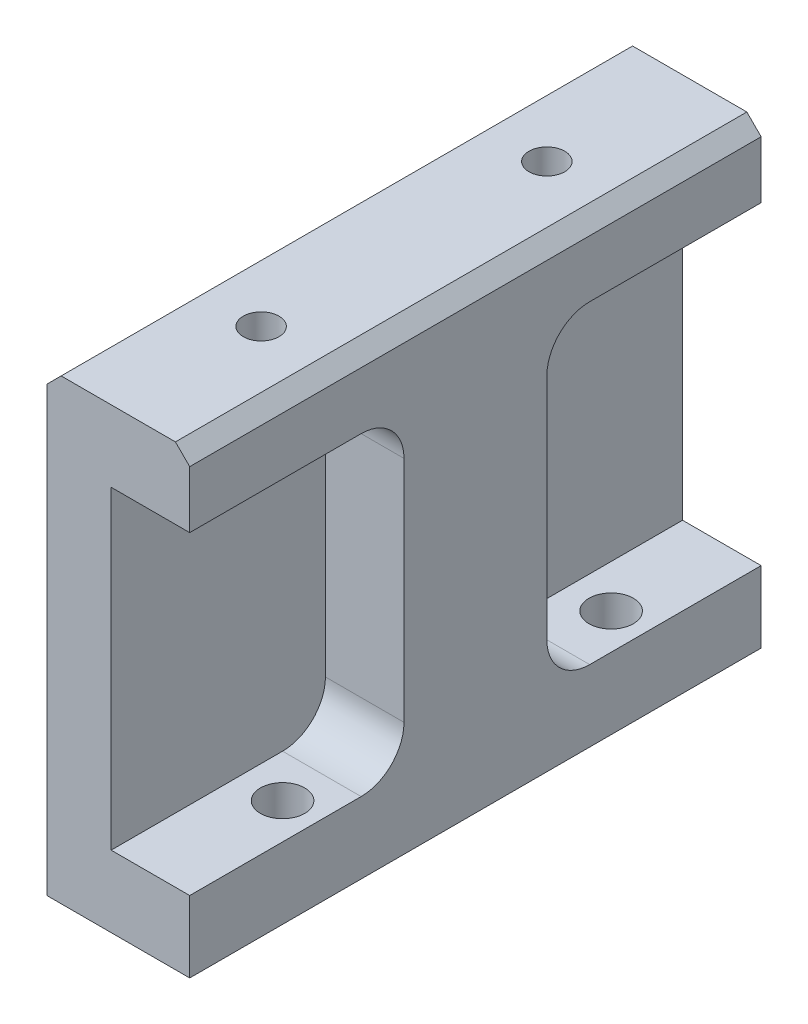
ISO-10303-21;
HEADER;
FILE_DESCRIPTION(('STEP AP214'),'2;1');
FILE_NAME('part.step','',(''),(''),'','','');
FILE_SCHEMA(('AUTOMOTIVE_DESIGN { 1 0 10303 214 1 1 1 1 }'));
ENDSEC;
DATA;
#1=APPLICATION_CONTEXT('core data for automotive mechanical design processes');
#2=APPLICATION_PROTOCOL_DEFINITION('international standard','automotive_design',2000,#1);
#3=PRODUCT_CONTEXT('',#1,'mechanical');
#4=PRODUCT('Part','Part','',(#3));
#5=PRODUCT_RELATED_PRODUCT_CATEGORY('part','',(#4));
#6=PRODUCT_DEFINITION_FORMATION('','',#4);
#7=PRODUCT_DEFINITION_CONTEXT('part definition',#1,'design');
#8=PRODUCT_DEFINITION('design','',#6,#7);
#9=PRODUCT_DEFINITION_SHAPE('','',#8);
#10=(LENGTH_UNIT() NAMED_UNIT(*) SI_UNIT(.MILLI.,.METRE.));
#11=(NAMED_UNIT(*) PLANE_ANGLE_UNIT() SI_UNIT($,.RADIAN.));
#12=(NAMED_UNIT(*) SI_UNIT($,.STERADIAN.) SOLID_ANGLE_UNIT());
#13=UNCERTAINTY_MEASURE_WITH_UNIT(LENGTH_MEASURE(1.E-05),#10,'distance_accuracy_value','');
#14=(GEOMETRIC_REPRESENTATION_CONTEXT(3) GLOBAL_UNCERTAINTY_ASSIGNED_CONTEXT((#13)) GLOBAL_UNIT_ASSIGNED_CONTEXT((#10,
#11,#12)) REPRESENTATION_CONTEXT('',''));
#15=CARTESIAN_POINT('',(0.,0.,0.));
#16=DIRECTION('',(0.,0.,1.));
#17=DIRECTION('',(1.,0.,0.));
#18=AXIS2_PLACEMENT_3D('',#15,#16,#17);
#19=CARTESIAN_POINT('',(4.5,24.,28.));
#20=DIRECTION('',(1.,0.,0.));
#21=DIRECTION('',(0.,1.,0.));
#22=AXIS2_PLACEMENT_3D('',#19,#20,#21);
#23=CYLINDRICAL_SURFACE('',#22,3.);
#24=CARTESIAN_POINT('',(10.,24.,28.));
#25=DIRECTION('',(-1.,0.,0.));
#26=DIRECTION('',(0.,1.,0.));
#27=AXIS2_PLACEMENT_3D('',#24,#25,#26);
#28=CIRCLE('',#27,3.);
#29=CARTESIAN_POINT('',(10.,27.,28.));
#30=VERTEX_POINT('',#29);
#31=CARTESIAN_POINT('',(10.,24.,25.));
#32=VERTEX_POINT('',#31);
#33=EDGE_CURVE('E318',#30,#32,#28,.T.);
#34=ORIENTED_EDGE('',*,*,#33,.F.);
#35=DIRECTION('',(1.,0.,0.));
#36=VECTOR('',#35,1.);
#37=CARTESIAN_POINT('',(10.,27.,28.));
#38=LINE('',#37,#36);
#39=CARTESIAN_POINT('',(4.50000000000006,27.,28.));
#40=VERTEX_POINT('',#39);
#41=EDGE_CURVE('E332',#40,#30,#38,.T.);
#42=ORIENTED_EDGE('',*,*,#41,.F.);
#43=CARTESIAN_POINT('',(4.5,24.,28.));
#44=DIRECTION('',(1.,0.,0.));
#45=DIRECTION('',(0.,1.,0.));
#46=AXIS2_PLACEMENT_3D('',#43,#44,#45);
#47=CIRCLE('',#46,3.);
#48=CARTESIAN_POINT('',(4.5,24.,25.));
#49=VERTEX_POINT('',#48);
#50=EDGE_CURVE('E301',#49,#40,#47,.T.);
#51=ORIENTED_EDGE('',*,*,#50,.F.);
#52=DIRECTION('',(-1.,0.,0.));
#53=VECTOR('',#52,1.);
#54=CARTESIAN_POINT('',(4.5,24.,25.));
#55=LINE('',#54,#53);
#56=EDGE_CURVE('E125',#32,#49,#55,.T.);
#57=ORIENTED_EDGE('',*,*,#56,.F.);
#58=EDGE_LOOP('',(#34,#42,#51,#57));
#59=FACE_BOUND('',#58,.T.);
#60=ADVANCED_FACE('F16',(#59),#23,.F.);
#61=CARTESIAN_POINT('',(4.5,8.,28.));
#62=DIRECTION('',(1.,0.,0.));
#63=DIRECTION('',(0.,1.,0.));
#64=AXIS2_PLACEMENT_3D('',#61,#62,#63);
#65=CYLINDRICAL_SURFACE('',#64,3.);
#66=CARTESIAN_POINT('',(10.,8.,28.));
#67=DIRECTION('',(-1.,0.,0.));
#68=DIRECTION('',(0.,1.,0.));
#69=AXIS2_PLACEMENT_3D('',#66,#67,#68);
#70=CIRCLE('',#69,3.);
#71=CARTESIAN_POINT('',(10.,8.,25.));
#72=VERTEX_POINT('',#71);
#73=CARTESIAN_POINT('',(10.,5.,28.));
#74=VERTEX_POINT('',#73);
#75=EDGE_CURVE('E275',#72,#74,#70,.T.);
#76=ORIENTED_EDGE('',*,*,#75,.F.);
#77=DIRECTION('',(1.,0.,0.));
#78=VECTOR('',#77,1.);
#79=CARTESIAN_POINT('',(10.,8.,25.));
#80=LINE('',#79,#78);
#81=CARTESIAN_POINT('',(4.5,8.,25.));
#82=VERTEX_POINT('',#81);
#83=EDGE_CURVE('E109',#82,#72,#80,.T.);
#84=ORIENTED_EDGE('',*,*,#83,.F.);
#85=CARTESIAN_POINT('',(4.5,8.,28.));
#86=DIRECTION('',(1.,0.,0.));
#87=DIRECTION('',(0.,1.,0.));
#88=AXIS2_PLACEMENT_3D('',#85,#86,#87);
#89=CIRCLE('',#88,3.);
#90=CARTESIAN_POINT('',(4.5,5.,28.));
#91=VERTEX_POINT('',#90);
#92=EDGE_CURVE('E326',#91,#82,#89,.T.);
#93=ORIENTED_EDGE('',*,*,#92,.F.);
#94=DIRECTION('',(-1.,0.,0.));
#95=VECTOR('',#94,1.);
#96=CARTESIAN_POINT('',(4.5,5.,28.));
#97=LINE('',#96,#95);
#98=EDGE_CURVE('E335',#74,#91,#97,.T.);
#99=ORIENTED_EDGE('',*,*,#98,.F.);
#100=EDGE_LOOP('',(#76,#84,#93,#99));
#101=FACE_BOUND('',#100,.T.);
#102=ADVANCED_FACE('F491',(#101),#65,.F.);
#103=CARTESIAN_POINT('',(4.5,8.,12.));
#104=DIRECTION('',(1.,0.,0.));
#105=DIRECTION('',(0.,1.,0.));
#106=AXIS2_PLACEMENT_3D('',#103,#104,#105);
#107=CYLINDRICAL_SURFACE('',#106,3.);
#108=CARTESIAN_POINT('',(10.,8.,12.));
#109=DIRECTION('',(-1.,0.,0.));
#110=DIRECTION('',(0.,1.,0.));
#111=AXIS2_PLACEMENT_3D('',#108,#109,#110);
#112=CIRCLE('',#111,3.);
#113=CARTESIAN_POINT('',(10.,5.,12.));
#114=VERTEX_POINT('',#113);
#115=CARTESIAN_POINT('',(10.,8.,15.));
#116=VERTEX_POINT('',#115);
#117=EDGE_CURVE('E247',#114,#116,#112,.T.);
#118=ORIENTED_EDGE('',*,*,#117,.F.);
#119=DIRECTION('',(1.,0.,0.));
#120=VECTOR('',#119,1.);
#121=CARTESIAN_POINT('',(10.,5.,12.));
#122=LINE('',#121,#120);
#123=CARTESIAN_POINT('',(4.5,5.,12.));
#124=VERTEX_POINT('',#123);
#125=EDGE_CURVE('E41',#124,#114,#122,.T.);
#126=ORIENTED_EDGE('',*,*,#125,.F.);
#127=CARTESIAN_POINT('',(4.5,8.,12.));
#128=DIRECTION('',(1.,0.,0.));
#129=DIRECTION('',(0.,1.,0.));
#130=AXIS2_PLACEMENT_3D('',#127,#128,#129);
#131=CIRCLE('',#130,3.);
#132=CARTESIAN_POINT('',(4.5,8.,15.));
#133=VERTEX_POINT('',#132);
#134=EDGE_CURVE('E287',#133,#124,#131,.T.);
#135=ORIENTED_EDGE('',*,*,#134,.F.);
#136=DIRECTION('',(-1.,0.,0.));
#137=VECTOR('',#136,1.);
#138=CARTESIAN_POINT('',(4.5,8.,15.));
#139=LINE('',#138,#137);
#140=EDGE_CURVE('E11',#116,#133,#139,.T.);
#141=ORIENTED_EDGE('',*,*,#140,.F.);
#142=EDGE_LOOP('',(#118,#126,#135,#141));
#143=FACE_BOUND('',#142,.T.);
#144=ADVANCED_FACE('F487',(#143),#107,.F.);
#145=CARTESIAN_POINT('',(4.5,24.,12.));
#146=DIRECTION('',(1.,0.,0.));
#147=DIRECTION('',(0.,1.,0.));
#148=AXIS2_PLACEMENT_3D('',#145,#146,#147);
#149=CYLINDRICAL_SURFACE('',#148,3.);
#150=CARTESIAN_POINT('',(10.,24.,12.));
#151=DIRECTION('',(-1.,0.,0.));
#152=DIRECTION('',(0.,1.,0.));
#153=AXIS2_PLACEMENT_3D('',#150,#151,#152);
#154=CIRCLE('',#153,3.);
#155=CARTESIAN_POINT('',(10.,24.,15.));
#156=VERTEX_POINT('',#155);
#157=CARTESIAN_POINT('',(10.,27.,12.));
#158=VERTEX_POINT('',#157);
#159=EDGE_CURVE('E281',#156,#158,#154,.T.);
#160=ORIENTED_EDGE('',*,*,#159,.F.);
#161=DIRECTION('',(1.,0.,0.));
#162=VECTOR('',#161,1.);
#163=CARTESIAN_POINT('',(10.,24.,15.));
#164=LINE('',#163,#162);
#165=CARTESIAN_POINT('',(4.5,24.,15.));
#166=VERTEX_POINT('',#165);
#167=EDGE_CURVE('E27',#166,#156,#164,.T.);
#168=ORIENTED_EDGE('',*,*,#167,.F.);
#169=CARTESIAN_POINT('',(4.5,24.,12.));
#170=DIRECTION('',(1.,0.,0.));
#171=DIRECTION('',(0.,1.,0.));
#172=AXIS2_PLACEMENT_3D('',#169,#170,#171);
#173=CIRCLE('',#172,3.);
#174=CARTESIAN_POINT('',(4.50000000000006,27.,12.));
#175=VERTEX_POINT('',#174);
#176=EDGE_CURVE('E376',#175,#166,#173,.T.);
#177=ORIENTED_EDGE('',*,*,#176,.F.);
#178=DIRECTION('',(-1.,0.,0.));
#179=VECTOR('',#178,1.);
#180=CARTESIAN_POINT('',(4.50000000000006,27.,12.));
#181=LINE('',#180,#179);
#182=EDGE_CURVE('E358',#158,#175,#181,.T.);
#183=ORIENTED_EDGE('',*,*,#182,.F.);
#184=EDGE_LOOP('',(#160,#168,#177,#183));
#185=FACE_BOUND('',#184,.T.);
#186=ADVANCED_FACE('F483',(#185),#149,.F.);
#187=CARTESIAN_POINT('',(4.50000000000006,27.,15.));
#188=DIRECTION('',(0.,0.,1.));
#189=DIRECTION('',(0.,-1.,0.));
#190=AXIS2_PLACEMENT_3D('',#187,#188,#189);
#191=PLANE('',#190);
#192=DIRECTION('',(0.,1.,0.));
#193=VECTOR('',#192,1.);
#194=CARTESIAN_POINT('',(4.50000000000006,27.,15.));
#195=LINE('',#194,#193);
#196=EDGE_CURVE('E292',#133,#166,#195,.T.);
#197=ORIENTED_EDGE('',*,*,#196,.T.);
#198=ORIENTED_EDGE('',*,*,#167,.T.);
#199=DIRECTION('',(0.,-1.,0.));
#200=VECTOR('',#199,1.);
#201=CARTESIAN_POINT('',(10.,27.,15.));
#202=LINE('',#201,#200);
#203=EDGE_CURVE('E366',#156,#116,#202,.T.);
#204=ORIENTED_EDGE('',*,*,#203,.T.);
#205=ORIENTED_EDGE('',*,*,#140,.T.);
#206=EDGE_LOOP('',(#197,#198,#204,#205));
#207=FACE_BOUND('',#206,.T.);
#208=ADVANCED_FACE('F486',(#207),#191,.F.);
#209=CARTESIAN_POINT('',(4.5,5.,15.));
#210=DIRECTION('',(0.,-1.,0.));
#211=DIRECTION('',(-1.,0.,0.));
#212=AXIS2_PLACEMENT_3D('',#209,#210,#211);
#213=PLANE('',#212);
#214=CARTESIAN_POINT('',(7.5,5.,8.));
#215=DIRECTION('',(0.,1.,0.));
#216=DIRECTION('',(1.,0.,0.));
#217=AXIS2_PLACEMENT_3D('',#214,#215,#216);
#218=CIRCLE('',#217,1.55);
#219=CARTESIAN_POINT('',(9.05,5.,8.));
#220=VERTEX_POINT('',#219);
#221=EDGE_CURVE('E350',#220,#220,#218,.T.);
#222=ORIENTED_EDGE('',*,*,#221,.F.);
#223=EDGE_LOOP('',(#222));
#224=FACE_BOUND('',#223,.T.);
#225=DIRECTION('',(0.,0.,1.));
#226=VECTOR('',#225,1.);
#227=CARTESIAN_POINT('',(4.5,5.,15.));
#228=LINE('',#227,#226);
#229=CARTESIAN_POINT('',(4.5,5.,0.));
#230=VERTEX_POINT('',#229);
#231=EDGE_CURVE('E291',#230,#124,#228,.T.);
#232=ORIENTED_EDGE('',*,*,#231,.T.);
#233=ORIENTED_EDGE('',*,*,#125,.T.);
#234=DIRECTION('',(0.,0.,-1.));
#235=VECTOR('',#234,1.);
#236=CARTESIAN_POINT('',(10.,5.,15.));
#237=LINE('',#236,#235);
#238=CARTESIAN_POINT('',(10.,5.,0.));
#239=VERTEX_POINT('',#238);
#240=EDGE_CURVE('E238',#114,#239,#237,.T.);
#241=ORIENTED_EDGE('',*,*,#240,.T.);
#242=DIRECTION('',(1.,0.,0.));
#243=VECTOR('',#242,1.);
#244=CARTESIAN_POINT('',(4.5,5.,0.));
#245=LINE('',#244,#243);
#246=EDGE_CURVE('E242',#230,#239,#245,.T.);
#247=ORIENTED_EDGE('',*,*,#246,.F.);
#248=EDGE_LOOP('',(#232,#233,#241,#247));
#249=FACE_BOUND('',#248,.T.);
#250=ADVANCED_FACE('F240',(#224,#249),#213,.F.);
#251=CARTESIAN_POINT('',(4.50000000000006,27.,0.));
#252=DIRECTION('',(0.,1.,0.));
#253=DIRECTION('',(1.,0.,0.));
#254=AXIS2_PLACEMENT_3D('',#251,#252,#253);
#255=PLANE('',#254);
#256=DIRECTION('',(0.,0.,1.));
#257=VECTOR('',#256,1.);
#258=CARTESIAN_POINT('',(10.,27.,0.));
#259=LINE('',#258,#257);
#260=CARTESIAN_POINT('',(10.,27.,0.));
#261=VERTEX_POINT('',#260);
#262=EDGE_CURVE('E277',#261,#158,#259,.T.);
#263=ORIENTED_EDGE('',*,*,#262,.T.);
#264=ORIENTED_EDGE('',*,*,#182,.T.);
#265=DIRECTION('',(0.,0.,-1.));
#266=VECTOR('',#265,1.);
#267=CARTESIAN_POINT('',(4.50000000000006,27.,0.));
#268=LINE('',#267,#266);
#269=CARTESIAN_POINT('',(4.50000000000006,27.,11.145643923739));
#270=VERTEX_POINT('',#269);
#271=EDGE_CURVE('E344',#175,#270,#268,.T.);
#272=ORIENTED_EDGE('',*,*,#271,.T.);
#273=CARTESIAN_POINT('',(5.,27.,10.));
#274=DIRECTION('',(0.,-1.,0.));
#275=DIRECTION('',(1.,0.,0.));
#276=AXIS2_PLACEMENT_3D('',#273,#274,#275);
#277=CIRCLE('',#276,1.25);
#278=CARTESIAN_POINT('',(4.50000000000006,27.,8.85435607626103));
#279=VERTEX_POINT('',#278);
#280=EDGE_CURVE('E536',#279,#270,#277,.T.);
#281=ORIENTED_EDGE('',*,*,#280,.F.);
#282=DIRECTION('',(0.,0.,-1.));
#283=VECTOR('',#282,1.);
#284=CARTESIAN_POINT('',(4.50000000000006,27.,0.));
#285=LINE('',#284,#283);
#286=CARTESIAN_POINT('',(4.50000000000006,27.,0.));
#287=VERTEX_POINT('',#286);
#288=EDGE_CURVE('E360',#279,#287,#285,.T.);
#289=ORIENTED_EDGE('',*,*,#288,.T.);
#290=DIRECTION('',(1.,0.,0.));
#291=VECTOR('',#290,1.);
#292=CARTESIAN_POINT('',(4.50000000000006,27.,0.));
#293=LINE('',#292,#291);
#294=EDGE_CURVE('E311',#287,#261,#293,.T.);
#295=ORIENTED_EDGE('',*,*,#294,.T.);
#296=EDGE_LOOP('',(#263,#264,#272,#281,#289,#295));
#297=FACE_BOUND('',#296,.T.);
#298=ADVANCED_FACE('F478',(#297),#255,.F.);
#299=CARTESIAN_POINT('',(4.5,0.,0.));
#300=DIRECTION('',(1.,0.,0.));
#301=DIRECTION('',(0.,-1.,0.));
#302=AXIS2_PLACEMENT_3D('',#299,#300,#301);
#303=PLANE('',#302);
#304=ORIENTED_EDGE('',*,*,#271,.F.);
#305=ORIENTED_EDGE('',*,*,#176,.T.);
#306=ORIENTED_EDGE('',*,*,#196,.F.);
#307=ORIENTED_EDGE('',*,*,#134,.T.);
#308=ORIENTED_EDGE('',*,*,#231,.F.);
#309=DIRECTION('',(0.,1.,0.));
#310=VECTOR('',#309,1.);
#311=CARTESIAN_POINT('',(4.5,5.,0.));
#312=LINE('',#311,#310);
#313=EDGE_CURVE('E265',#230,#287,#312,.T.);
#314=ORIENTED_EDGE('',*,*,#313,.T.);
#315=ORIENTED_EDGE('',*,*,#288,.F.);
#316=CARTESIAN_POINT('',(4.50000000000006,27.,8.85435607626103));
#317=CARTESIAN_POINT('',(4.50000000000006,26.8483602135071,9.12971539618068));
#318=CARTESIAN_POINT('',(4.50000000000006,26.7669442770331,9.29615331183565));
#319=CARTESIAN_POINT('',(4.50000000000006,26.546946692338,9.74589252791029));
#320=CARTESIAN_POINT('',(4.50000000000006,26.549875567175,10.0044409370433));
#321=CARTESIAN_POINT('',(4.50000000000006,26.5525618473337,10.2415741367161));
#322=CARTESIAN_POINT('',(4.50000000000006,26.7128335453011,10.5966485226479));
#323=CARTESIAN_POINT('',(4.50000000000006,26.7817472967959,10.7493236880364));
#324=CARTESIAN_POINT('',(4.50000000000006,27.,11.145643923739));
#325=B_SPLINE_CURVE_WITH_KNOTS('',2,(#316,#317,#318,#319,#320,#321,#322,#323,#324),
.UNSPECIFIED.,.F.,.F.,(3,2,2,2,3),(0.,0.2,0.5,0.75,1.),.UNSPECIFIED.);
#326=EDGE_CURVE('E448',#279,#270,#325,.T.);
#327=ORIENTED_EDGE('',*,*,#326,.T.);
#328=EDGE_LOOP('',(#304,#305,#306,#307,#308,#314,#315,#327));
#329=FACE_BOUND('',#328,.T.);
#330=ADVANCED_FACE('F481',(#329),#303,.T.);
#331=CARTESIAN_POINT('',(4.5,5.,25.));
#332=DIRECTION('',(0.,0.,-1.));
#333=DIRECTION('',(0.,-1.,0.));
#334=AXIS2_PLACEMENT_3D('',#331,#332,#333);
#335=PLANE('',#334);
#336=DIRECTION('',(0.,-1.,0.));
#337=VECTOR('',#336,1.);
#338=CARTESIAN_POINT('',(4.5,5.,25.));
#339=LINE('',#338,#337);
#340=EDGE_CURVE('E305',#49,#82,#339,.T.);
#341=ORIENTED_EDGE('',*,*,#340,.T.);
#342=ORIENTED_EDGE('',*,*,#83,.T.);
#343=DIRECTION('',(0.,1.,0.));
#344=VECTOR('',#343,1.);
#345=CARTESIAN_POINT('',(10.,5.,25.));
#346=LINE('',#345,#344);
#347=EDGE_CURVE('E322',#72,#32,#346,.T.);
#348=ORIENTED_EDGE('',*,*,#347,.T.);
#349=ORIENTED_EDGE('',*,*,#56,.T.);
#350=EDGE_LOOP('',(#341,#342,#348,#349));
#351=FACE_BOUND('',#350,.T.);
#352=ADVANCED_FACE('F497',(#351),#335,.F.);
#353=CARTESIAN_POINT('',(4.5,5.,40.));
#354=DIRECTION('',(0.,-1.,0.));
#355=DIRECTION('',(-1.,0.,0.));
#356=AXIS2_PLACEMENT_3D('',#353,#354,#355);
#357=PLANE('',#356);
#358=CARTESIAN_POINT('',(7.5,5.,31.));
#359=DIRECTION('',(0.,1.,0.));
#360=DIRECTION('',(1.,0.,0.));
#361=AXIS2_PLACEMENT_3D('',#358,#359,#360);
#362=CIRCLE('',#361,1.55);
#363=CARTESIAN_POINT('',(9.05,5.,31.));
#364=VERTEX_POINT('',#363);
#365=EDGE_CURVE('E345',#364,#364,#362,.T.);
#366=ORIENTED_EDGE('',*,*,#365,.F.);
#367=EDGE_LOOP('',(#366));
#368=FACE_BOUND('',#367,.T.);
#369=DIRECTION('',(0.,0.,-1.));
#370=VECTOR('',#369,1.);
#371=CARTESIAN_POINT('',(10.,5.,40.));
#372=LINE('',#371,#370);
#373=CARTESIAN_POINT('',(10.,5.,40.));
#374=VERTEX_POINT('',#373);
#375=EDGE_CURVE('E352',#374,#74,#372,.T.);
#376=ORIENTED_EDGE('',*,*,#375,.T.);
#377=ORIENTED_EDGE('',*,*,#98,.T.);
#378=DIRECTION('',(0.,0.,1.));
#379=VECTOR('',#378,1.);
#380=CARTESIAN_POINT('',(4.5,5.,40.));
#381=LINE('',#380,#379);
#382=CARTESIAN_POINT('',(4.5,5.,40.));
#383=VERTEX_POINT('',#382);
#384=EDGE_CURVE('E349',#91,#383,#381,.T.);
#385=ORIENTED_EDGE('',*,*,#384,.T.);
#386=DIRECTION('',(1.,0.,0.));
#387=VECTOR('',#386,1.);
#388=CARTESIAN_POINT('',(4.5,5.,40.));
#389=LINE('',#388,#387);
#390=EDGE_CURVE('E418',#383,#374,#389,.T.);
#391=ORIENTED_EDGE('',*,*,#390,.T.);
#392=EDGE_LOOP('',(#376,#377,#385,#391));
#393=FACE_BOUND('',#392,.T.);
#394=ADVANCED_FACE('F499',(#368,#393),#357,.F.);
#395=CARTESIAN_POINT('',(4.50000000000006,27.,25.));
#396=DIRECTION('',(0.,1.,0.));
#397=DIRECTION('',(1.,0.,0.));
#398=AXIS2_PLACEMENT_3D('',#395,#396,#397);
#399=PLANE('',#398);
#400=DIRECTION('',(0.,0.,-1.));
#401=VECTOR('',#400,1.);
#402=CARTESIAN_POINT('',(4.50000000000006,27.,25.));
#403=LINE('',#402,#401);
#404=CARTESIAN_POINT('',(4.50000000000006,27.,28.854356076261));
#405=VERTEX_POINT('',#404);
#406=EDGE_CURVE('E304',#405,#40,#403,.T.);
#407=ORIENTED_EDGE('',*,*,#406,.T.);
#408=ORIENTED_EDGE('',*,*,#41,.T.);
#409=DIRECTION('',(0.,0.,1.));
#410=VECTOR('',#409,1.);
#411=CARTESIAN_POINT('',(10.,27.,25.));
#412=LINE('',#411,#410);
#413=CARTESIAN_POINT('',(10.,27.,40.));
#414=VERTEX_POINT('',#413);
#415=EDGE_CURVE('E323',#30,#414,#412,.T.);
#416=ORIENTED_EDGE('',*,*,#415,.T.);
#417=DIRECTION('',(1.,0.,0.));
#418=VECTOR('',#417,1.);
#419=CARTESIAN_POINT('',(4.50000000000006,27.,40.));
#420=LINE('',#419,#418);
#421=CARTESIAN_POINT('',(4.50000000000006,27.,40.));
#422=VERTEX_POINT('',#421);
#423=EDGE_CURVE('E362',#422,#414,#420,.T.);
#424=ORIENTED_EDGE('',*,*,#423,.F.);
#425=DIRECTION('',(0.,0.,-1.));
#426=VECTOR('',#425,1.);
#427=CARTESIAN_POINT('',(4.50000000000006,27.,25.));
#428=LINE('',#427,#426);
#429=CARTESIAN_POINT('',(4.50000000000006,27.,31.145643923739));
#430=VERTEX_POINT('',#429);
#431=EDGE_CURVE('E336',#422,#430,#428,.T.);
#432=ORIENTED_EDGE('',*,*,#431,.T.);
#433=CARTESIAN_POINT('',(5.,27.,30.));
#434=DIRECTION('',(0.,-1.,0.));
#435=DIRECTION('',(1.,0.,0.));
#436=AXIS2_PLACEMENT_3D('',#433,#434,#435);
#437=CIRCLE('',#436,1.25);
#438=EDGE_CURVE('E520',#405,#430,#437,.T.);
#439=ORIENTED_EDGE('',*,*,#438,.F.);
#440=EDGE_LOOP('',(#407,#408,#416,#424,#432,#439));
#441=FACE_BOUND('',#440,.T.);
#442=ADVANCED_FACE('F471',(#441),#399,.F.);
#443=CARTESIAN_POINT('',(4.5,0.,0.));
#444=DIRECTION('',(1.,0.,0.));
#445=DIRECTION('',(0.,-1.,0.));
#446=AXIS2_PLACEMENT_3D('',#443,#444,#445);
#447=PLANE('',#446);
#448=ORIENTED_EDGE('',*,*,#384,.F.);
#449=ORIENTED_EDGE('',*,*,#92,.T.);
#450=ORIENTED_EDGE('',*,*,#340,.F.);
#451=ORIENTED_EDGE('',*,*,#50,.T.);
#452=ORIENTED_EDGE('',*,*,#406,.F.);
#453=CARTESIAN_POINT('',(4.50000000000006,27.,28.854356076261));
#454=CARTESIAN_POINT('',(4.50000000000005,26.8483602135231,29.1297153961521));
#455=CARTESIAN_POINT('',(4.50000000000005,26.7669442770331,29.2961533118356));
#456=CARTESIAN_POINT('',(4.50000000000005,26.5469466923379,29.7458925278992));
#457=CARTESIAN_POINT('',(4.50000000000005,26.549875567175,30.0044409370432));
#458=CARTESIAN_POINT('',(4.50000000000005,26.5525618473338,30.2415741367179));
#459=CARTESIAN_POINT('',(4.50000000000005,26.7128335453011,30.5966485226479));
#460=CARTESIAN_POINT('',(4.50000000000005,26.7817472967977,30.7493236880396));
#461=CARTESIAN_POINT('',(4.50000000000006,27.,31.145643923739));
#462=B_SPLINE_CURVE_WITH_KNOTS('',2,(#453,#454,#455,#456,#457,#458,#459,#460,#461),
.UNSPECIFIED.,.F.,.F.,(3,2,2,2,3),(0.,0.2,0.5,0.75,1.),.UNSPECIFIED.);
#463=EDGE_CURVE('E454',#405,#430,#462,.T.);
#464=ORIENTED_EDGE('',*,*,#463,.T.);
#465=ORIENTED_EDGE('',*,*,#431,.F.);
#466=DIRECTION('',(0.,-1.,0.));
#467=VECTOR('',#466,1.);
#468=CARTESIAN_POINT('',(4.50000000000006,27.,40.));
#469=LINE('',#468,#467);
#470=EDGE_CURVE('E330',#422,#383,#469,.T.);
#471=ORIENTED_EDGE('',*,*,#470,.T.);
#472=EDGE_LOOP('',(#448,#449,#450,#451,#452,#464,#465,#471));
#473=FACE_BOUND('',#472,.T.);
#474=ADVANCED_FACE('F460',(#473),#447,.T.);
#475=CARTESIAN_POINT('',(0.,31.,40.));
#476=DIRECTION('',(0.707106781186547,-0.707106781186548,0.));
#477=DIRECTION('',(0.,0.,-1.));
#478=AXIS2_PLACEMENT_3D('',#475,#476,#477);
#479=PLANE('',#478);
#480=DIRECTION('',(-0.707106781186548,-0.707106781186547,0.));
#481=VECTOR('',#480,1.);
#482=CARTESIAN_POINT('',(0.,31.,40.));
#483=LINE('',#482,#481);
#484=CARTESIAN_POINT('',(1.00000000000003,32.,40.));
#485=VERTEX_POINT('',#484);
#486=CARTESIAN_POINT('',(0.,31.,40.));
#487=VERTEX_POINT('',#486);
#488=EDGE_CURVE('E190',#485,#487,#483,.T.);
#489=ORIENTED_EDGE('',*,*,#488,.F.);
#490=DIRECTION('',(0.,0.,1.));
#491=VECTOR('',#490,1.);
#492=CARTESIAN_POINT('',(1.00000000000003,32.,40.));
#493=LINE('',#492,#491);
#494=CARTESIAN_POINT('',(1.00000000000003,32.,0.));
#495=VERTEX_POINT('',#494);
#496=EDGE_CURVE('E300',#495,#485,#493,.T.);
#497=ORIENTED_EDGE('',*,*,#496,.F.);
#498=DIRECTION('',(0.707106781186548,0.707106781186547,0.));
#499=VECTOR('',#498,1.);
#500=CARTESIAN_POINT('',(-15.5,15.5,0.));
#501=LINE('',#500,#499);
#502=CARTESIAN_POINT('',(0.,31.,0.));
#503=VERTEX_POINT('',#502);
#504=EDGE_CURVE('E317',#503,#495,#501,.T.);
#505=ORIENTED_EDGE('',*,*,#504,.F.);
#506=DIRECTION('',(0.,0.,-1.));
#507=VECTOR('',#506,1.);
#508=CARTESIAN_POINT('',(0.,31.,40.));
#509=LINE('',#508,#507);
#510=EDGE_CURVE('E390',#487,#503,#509,.T.);
#511=ORIENTED_EDGE('',*,*,#510,.F.);
#512=EDGE_LOOP('',(#489,#497,#505,#511));
#513=FACE_BOUND('',#512,.T.);
#514=ADVANCED_FACE('F470',(#513),#479,.F.);
#515=CARTESIAN_POINT('',(9.,32.,40.));
#516=DIRECTION('',(-0.707106781186548,-0.707106781186548,0.));
#517=DIRECTION('',(-0.707106781186548,0.707106781186548,0.));
#518=AXIS2_PLACEMENT_3D('',#515,#516,#517);
#519=PLANE('',#518);
#520=DIRECTION('',(-0.707106781186548,0.707106781186548,0.));
#521=VECTOR('',#520,1.);
#522=CARTESIAN_POINT('',(9.,32.,40.));
#523=LINE('',#522,#521);
#524=CARTESIAN_POINT('',(10.,31.,40.));
#525=VERTEX_POINT('',#524);
#526=CARTESIAN_POINT('',(9.,32.,40.));
#527=VERTEX_POINT('',#526);
#528=EDGE_CURVE('E365',#525,#527,#523,.T.);
#529=ORIENTED_EDGE('',*,*,#528,.F.);
#530=DIRECTION('',(0.,0.,1.));
#531=VECTOR('',#530,1.);
#532=CARTESIAN_POINT('',(10.,31.,40.));
#533=LINE('',#532,#531);
#534=CARTESIAN_POINT('',(10.,31.,0.));
#535=VERTEX_POINT('',#534);
#536=EDGE_CURVE('E280',#535,#525,#533,.T.);
#537=ORIENTED_EDGE('',*,*,#536,.F.);
#538=DIRECTION('',(0.707106781186548,-0.707106781186548,0.));
#539=VECTOR('',#538,1.);
#540=CARTESIAN_POINT('',(20.5,20.5,0.));
#541=LINE('',#540,#539);
#542=CARTESIAN_POINT('',(9.,32.,0.));
#543=VERTEX_POINT('',#542);
#544=EDGE_CURVE('E312',#543,#535,#541,.T.);
#545=ORIENTED_EDGE('',*,*,#544,.F.);
#546=DIRECTION('',(0.,0.,-1.));
#547=VECTOR('',#546,1.);
#548=CARTESIAN_POINT('',(9.,32.,40.));
#549=LINE('',#548,#547);
#550=EDGE_CURVE('E327',#527,#543,#549,.T.);
#551=ORIENTED_EDGE('',*,*,#550,.F.);
#552=EDGE_LOOP('',(#529,#537,#545,#551));
#553=FACE_BOUND('',#552,.T.);
#554=ADVANCED_FACE('F494',(#553),#519,.F.);
#555=CARTESIAN_POINT('',(7.5,0.,31.));
#556=DIRECTION('',(0.,1.,0.));
#557=DIRECTION('',(0.,0.,1.));
#558=AXIS2_PLACEMENT_3D('',#555,#556,#557);
#559=CYLINDRICAL_SURFACE('',#558,1.55);
#560=CARTESIAN_POINT('',(7.5,0.,31.));
#561=DIRECTION('',(0.,1.,0.));
#562=DIRECTION('',(0.,0.,1.));
#563=AXIS2_PLACEMENT_3D('',#560,#561,#562);
#564=CIRCLE('',#563,1.55);
#565=CARTESIAN_POINT('',(7.5,0.,32.55));
#566=VERTEX_POINT('',#565);
#567=EDGE_CURVE('E286',#566,#566,#564,.T.);
#568=ORIENTED_EDGE('',*,*,#567,.F.);
#569=EDGE_LOOP('',(#568));
#570=FACE_BOUND('',#569,.T.);
#571=ORIENTED_EDGE('',*,*,#365,.T.);
#572=EDGE_LOOP('',(#571));
#573=FACE_BOUND('',#572,.T.);
#574=ADVANCED_FACE('F18',(#570,#573),#559,.F.);
#575=CARTESIAN_POINT('',(7.5,0.,8.));
#576=DIRECTION('',(0.,1.,0.));
#577=DIRECTION('',(0.,0.,1.));
#578=AXIS2_PLACEMENT_3D('',#575,#576,#577);
#579=CYLINDRICAL_SURFACE('',#578,1.55);
#580=CARTESIAN_POINT('',(7.5,0.,8.));
#581=DIRECTION('',(0.,1.,0.));
#582=DIRECTION('',(0.,0.,1.));
#583=AXIS2_PLACEMENT_3D('',#580,#581,#582);
#584=CIRCLE('',#583,1.55);
#585=CARTESIAN_POINT('',(7.5,0.,9.55));
#586=VERTEX_POINT('',#585);
#587=EDGE_CURVE('E282',#586,#586,#584,.T.);
#588=ORIENTED_EDGE('',*,*,#587,.F.);
#589=EDGE_LOOP('',(#588));
#590=FACE_BOUND('',#589,.T.);
#591=ORIENTED_EDGE('',*,*,#221,.T.);
#592=EDGE_LOOP('',(#591));
#593=FACE_BOUND('',#592,.T.);
#594=ADVANCED_FACE('F679',(#590,#593),#579,.F.);
#595=CARTESIAN_POINT('',(5.,32.,30.));
#596=DIRECTION('',(0.,-1.,0.));
#597=DIRECTION('',(1.,0.,0.));
#598=AXIS2_PLACEMENT_3D('',#595,#596,#597);
#599=CYLINDRICAL_SURFACE('',#598,1.25);
#600=CARTESIAN_POINT('',(5.,32.,30.));
#601=DIRECTION('',(0.,-1.,0.));
#602=DIRECTION('',(1.,0.,0.));
#603=AXIS2_PLACEMENT_3D('',#600,#601,#602);
#604=CIRCLE('',#603,1.25);
#605=CARTESIAN_POINT('',(6.25,32.,30.));
#606=VERTEX_POINT('',#605);
#607=EDGE_CURVE('E180',#606,#606,#604,.T.);
#608=ORIENTED_EDGE('',*,*,#607,.F.);
#609=EDGE_LOOP('',(#608));
#610=FACE_BOUND('',#609,.T.);
#611=CARTESIAN_POINT('',(5.,27.,30.));
#612=DIRECTION('',(0.,1.,0.));
#613=DIRECTION('',(1.,0.,0.));
#614=AXIS2_PLACEMENT_3D('',#611,#612,#613);
#615=CIRCLE('',#614,1.25);
#616=EDGE_CURVE('E248',#405,#430,#615,.T.);
#617=ORIENTED_EDGE('',*,*,#616,.F.);
#618=ORIENTED_EDGE('',*,*,#438,.T.);
#619=EDGE_LOOP('',(#617,#618));
#620=FACE_BOUND('',#619,.T.);
#621=ADVANCED_FACE('F472',(#610,#620),#599,.F.);
#622=CARTESIAN_POINT('',(5.,32.,10.));
#623=DIRECTION('',(0.,-1.,0.));
#624=DIRECTION('',(1.,0.,0.));
#625=AXIS2_PLACEMENT_3D('',#622,#623,#624);
#626=CYLINDRICAL_SURFACE('',#625,1.25);
#627=CARTESIAN_POINT('',(5.,32.,10.));
#628=DIRECTION('',(0.,-1.,0.));
#629=DIRECTION('',(1.,0.,0.));
#630=AXIS2_PLACEMENT_3D('',#627,#628,#629);
#631=CIRCLE('',#630,1.25);
#632=CARTESIAN_POINT('',(6.25,32.,10.));
#633=VERTEX_POINT('',#632);
#634=EDGE_CURVE('E297',#633,#633,#631,.T.);
#635=ORIENTED_EDGE('',*,*,#634,.F.);
#636=EDGE_LOOP('',(#635));
#637=FACE_BOUND('',#636,.T.);
#638=CARTESIAN_POINT('',(5.,27.,10.));
#639=DIRECTION('',(0.,1.,0.));
#640=DIRECTION('',(1.,0.,0.));
#641=AXIS2_PLACEMENT_3D('',#638,#639,#640);
#642=CIRCLE('',#641,1.25);
#643=EDGE_CURVE('E588',#279,#270,#642,.T.);
#644=ORIENTED_EDGE('',*,*,#643,.F.);
#645=ORIENTED_EDGE('',*,*,#280,.T.);
#646=EDGE_LOOP('',(#644,#645));
#647=FACE_BOUND('',#646,.T.);
#648=ADVANCED_FACE('F599',(#637,#647),#626,.F.);
#649=CARTESIAN_POINT('',(0.,0.,40.));
#650=DIRECTION('',(0.,0.,-1.));
#651=DIRECTION('',(0.,-1.,0.));
#652=AXIS2_PLACEMENT_3D('',#649,#650,#651);
#653=PLANE('',#652);
#654=ORIENTED_EDGE('',*,*,#470,.F.);
#655=ORIENTED_EDGE('',*,*,#423,.T.);
#656=DIRECTION('',(0.,-1.,0.));
#657=VECTOR('',#656,1.);
#658=CARTESIAN_POINT('',(10.,32.,40.));
#659=LINE('',#658,#657);
#660=EDGE_CURVE('E383',#525,#414,#659,.T.);
#661=ORIENTED_EDGE('',*,*,#660,.F.);
#662=ORIENTED_EDGE('',*,*,#528,.T.);
#663=DIRECTION('',(1.,0.,0.));
#664=VECTOR('',#663,1.);
#665=CARTESIAN_POINT('',(0.,32.,40.));
#666=LINE('',#665,#664);
#667=EDGE_CURVE('E331',#485,#527,#666,.T.);
#668=ORIENTED_EDGE('',*,*,#667,.F.);
#669=ORIENTED_EDGE('',*,*,#488,.T.);
#670=DIRECTION('',(0.,1.,0.));
#671=VECTOR('',#670,1.);
#672=CARTESIAN_POINT('',(0.,0.,40.));
#673=LINE('',#672,#671);
#674=CARTESIAN_POINT('',(0.,0.,40.));
#675=VERTEX_POINT('',#674);
#676=EDGE_CURVE('E296',#675,#487,#673,.T.);
#677=ORIENTED_EDGE('',*,*,#676,.F.);
#678=DIRECTION('',(-1.,0.,0.));
#679=VECTOR('',#678,1.);
#680=CARTESIAN_POINT('',(10.,0.,40.));
#681=LINE('',#680,#679);
#682=CARTESIAN_POINT('',(10.,0.,40.));
#683=VERTEX_POINT('',#682);
#684=EDGE_CURVE('E285',#683,#675,#681,.T.);
#685=ORIENTED_EDGE('',*,*,#684,.F.);
#686=DIRECTION('',(0.,-1.,0.));
#687=VECTOR('',#686,1.);
#688=CARTESIAN_POINT('',(10.,32.,40.));
#689=LINE('',#688,#687);
#690=EDGE_CURVE('E341',#374,#683,#689,.T.);
#691=ORIENTED_EDGE('',*,*,#690,.F.);
#692=ORIENTED_EDGE('',*,*,#390,.F.);
#693=EDGE_LOOP('',(#654,#655,#661,#662,#668,#669,#677,#685,#691,#692));
#694=FACE_BOUND('',#693,.T.);
#695=ADVANCED_FACE('F658',(#694),#653,.F.);
#696=CARTESIAN_POINT('',(0.,32.,40.));
#697=DIRECTION('',(0.,1.,0.));
#698=DIRECTION('',(1.,0.,0.));
#699=AXIS2_PLACEMENT_3D('',#696,#697,#698);
#700=PLANE('',#699);
#701=DIRECTION('',(1.,0.,0.));
#702=VECTOR('',#701,1.);
#703=CARTESIAN_POINT('',(0.,32.,0.));
#704=LINE('',#703,#702);
#705=EDGE_CURVE('E313',#495,#543,#704,.T.);
#706=ORIENTED_EDGE('',*,*,#705,.F.);
#707=ORIENTED_EDGE('',*,*,#496,.T.);
#708=ORIENTED_EDGE('',*,*,#667,.T.);
#709=ORIENTED_EDGE('',*,*,#550,.T.);
#710=EDGE_LOOP('',(#706,#707,#708,#709));
#711=FACE_BOUND('',#710,.T.);
#712=ORIENTED_EDGE('',*,*,#634,.T.);
#713=EDGE_LOOP('',(#712));
#714=FACE_BOUND('',#713,.T.);
#715=ORIENTED_EDGE('',*,*,#607,.T.);
#716=EDGE_LOOP('',(#715));
#717=FACE_BOUND('',#716,.T.);
#718=ADVANCED_FACE('F654',(#711,#714,#717),#700,.T.);
#719=CARTESIAN_POINT('',(0.,0.,40.));
#720=DIRECTION('',(-1.,0.,0.));
#721=DIRECTION('',(0.,0.,1.));
#722=AXIS2_PLACEMENT_3D('',#719,#720,#721);
#723=PLANE('',#722);
#724=ORIENTED_EDGE('',*,*,#676,.T.);
#725=ORIENTED_EDGE('',*,*,#510,.T.);
#726=DIRECTION('',(0.,1.,0.));
#727=VECTOR('',#726,1.);
#728=CARTESIAN_POINT('',(0.,0.,0.));
#729=LINE('',#728,#727);
#730=CARTESIAN_POINT('',(0.,0.,0.));
#731=VERTEX_POINT('',#730);
#732=EDGE_CURVE('E410',#731,#503,#729,.T.);
#733=ORIENTED_EDGE('',*,*,#732,.F.);
#734=DIRECTION('',(0.,0.,-1.));
#735=VECTOR('',#734,1.);
#736=CARTESIAN_POINT('',(0.,0.,40.));
#737=LINE('',#736,#735);
#738=EDGE_CURVE('E293',#675,#731,#737,.T.);
#739=ORIENTED_EDGE('',*,*,#738,.F.);
#740=EDGE_LOOP('',(#724,#725,#733,#739));
#741=FACE_BOUND('',#740,.T.);
#742=ADVANCED_FACE('F561',(#741),#723,.T.);
#743=CARTESIAN_POINT('',(10.,0.,40.));
#744=DIRECTION('',(0.,-1.,0.));
#745=DIRECTION('',(0.,0.,-1.));
#746=AXIS2_PLACEMENT_3D('',#743,#744,#745);
#747=PLANE('',#746);
#748=DIRECTION('',(-1.,0.,0.));
#749=VECTOR('',#748,1.);
#750=CARTESIAN_POINT('',(10.,0.,0.));
#751=LINE('',#750,#749);
#752=CARTESIAN_POINT('',(10.,0.,0.));
#753=VERTEX_POINT('',#752);
#754=EDGE_CURVE('E260',#753,#731,#751,.T.);
#755=ORIENTED_EDGE('',*,*,#754,.F.);
#756=DIRECTION('',(0.,0.,-1.));
#757=VECTOR('',#756,1.);
#758=CARTESIAN_POINT('',(10.,0.,40.));
#759=LINE('',#758,#757);
#760=EDGE_CURVE('E255',#683,#753,#759,.T.);
#761=ORIENTED_EDGE('',*,*,#760,.F.);
#762=ORIENTED_EDGE('',*,*,#684,.T.);
#763=ORIENTED_EDGE('',*,*,#738,.T.);
#764=EDGE_LOOP('',(#755,#761,#762,#763));
#765=FACE_BOUND('',#764,.T.);
#766=ORIENTED_EDGE('',*,*,#587,.T.);
#767=EDGE_LOOP('',(#766));
#768=FACE_BOUND('',#767,.T.);
#769=ORIENTED_EDGE('',*,*,#567,.T.);
#770=EDGE_LOOP('',(#769));
#771=FACE_BOUND('',#770,.T.);
#772=ADVANCED_FACE('F477',(#765,#768,#771),#747,.T.);
#773=CARTESIAN_POINT('',(10.,32.,40.));
#774=DIRECTION('',(1.,0.,0.));
#775=DIRECTION('',(0.,-1.,0.));
#776=AXIS2_PLACEMENT_3D('',#773,#774,#775);
#777=PLANE('',#776);
#778=ORIENTED_EDGE('',*,*,#240,.F.);
#779=ORIENTED_EDGE('',*,*,#117,.T.);
#780=ORIENTED_EDGE('',*,*,#203,.F.);
#781=ORIENTED_EDGE('',*,*,#159,.T.);
#782=ORIENTED_EDGE('',*,*,#262,.F.);
#783=DIRECTION('',(0.,-1.,0.));
#784=VECTOR('',#783,1.);
#785=CARTESIAN_POINT('',(10.,32.,0.));
#786=LINE('',#785,#784);
#787=EDGE_CURVE('E307',#535,#261,#786,.T.);
#788=ORIENTED_EDGE('',*,*,#787,.F.);
#789=ORIENTED_EDGE('',*,*,#536,.T.);
#790=ORIENTED_EDGE('',*,*,#660,.T.);
#791=ORIENTED_EDGE('',*,*,#415,.F.);
#792=ORIENTED_EDGE('',*,*,#33,.T.);
#793=ORIENTED_EDGE('',*,*,#347,.F.);
#794=ORIENTED_EDGE('',*,*,#75,.T.);
#795=ORIENTED_EDGE('',*,*,#375,.F.);
#796=ORIENTED_EDGE('',*,*,#690,.T.);
#797=ORIENTED_EDGE('',*,*,#760,.T.);
#798=DIRECTION('',(0.,-1.,0.));
#799=VECTOR('',#798,1.);
#800=CARTESIAN_POINT('',(10.,32.,0.));
#801=LINE('',#800,#799);
#802=EDGE_CURVE('E251',#239,#753,#801,.T.);
#803=ORIENTED_EDGE('',*,*,#802,.F.);
#804=EDGE_LOOP('',(#778,#779,#780,#781,#782,#788,#789,#790,#791,#792,#793,#794,#795,#796,#797,#803));
#805=FACE_BOUND('',#804,.T.);
#806=ADVANCED_FACE('F252',(#805),#777,.T.);
#807=CARTESIAN_POINT('',(5.,27.,30.));
#808=DIRECTION('',(0.,1.,0.));
#809=DIRECTION('',(-1.,0.,0.));
#810=AXIS2_PLACEMENT_3D('',#807,#808,#809);
#811=CONICAL_SURFACE('',#810,1.25,1.0297442575);
#812=ORIENTED_EDGE('',*,*,#463,.F.);
#813=ORIENTED_EDGE('',*,*,#616,.T.);
#814=EDGE_LOOP('',(#812,#813));
#815=FACE_BOUND('',#814,.T.);
#816=ADVANCED_FACE('F476',(#815),#811,.F.);
#817=CARTESIAN_POINT('',(5.,27.,10.));
#818=DIRECTION('',(0.,1.,0.));
#819=DIRECTION('',(-1.,0.,0.));
#820=AXIS2_PLACEMENT_3D('',#817,#818,#819);
#821=CONICAL_SURFACE('',#820,1.25,1.0297442575);
#822=ORIENTED_EDGE('',*,*,#326,.F.);
#823=ORIENTED_EDGE('',*,*,#643,.T.);
#824=EDGE_LOOP('',(#822,#823));
#825=FACE_BOUND('',#824,.T.);
#826=ADVANCED_FACE('F566',(#825),#821,.F.);
#827=CARTESIAN_POINT('',(0.,0.,0.));
#828=DIRECTION('',(0.,0.,-1.));
#829=DIRECTION('',(0.,-1.,0.));
#830=AXIS2_PLACEMENT_3D('',#827,#828,#829);
#831=PLANE('',#830);
#832=ORIENTED_EDGE('',*,*,#313,.F.);
#833=ORIENTED_EDGE('',*,*,#246,.T.);
#834=ORIENTED_EDGE('',*,*,#802,.T.);
#835=ORIENTED_EDGE('',*,*,#754,.T.);
#836=ORIENTED_EDGE('',*,*,#732,.T.);
#837=ORIENTED_EDGE('',*,*,#504,.T.);
#838=ORIENTED_EDGE('',*,*,#705,.T.);
#839=ORIENTED_EDGE('',*,*,#544,.T.);
#840=ORIENTED_EDGE('',*,*,#787,.T.);
#841=ORIENTED_EDGE('',*,*,#294,.F.);
#842=EDGE_LOOP('',(#832,#833,#834,#835,#836,#837,#838,#839,#840,#841));
#843=FACE_BOUND('',#842,.T.);
#844=ADVANCED_FACE('F262',(#843),#831,.T.);
#845=CLOSED_SHELL('',(#60,#102,#144,#186,#208,#250,#298,#330,#352,#394,#442,#474,#514,#554,#574,
#594,#621,#648,#695,#718,#742,#772,#806,#816,#826,#844));
#846=MANIFOLD_SOLID_BREP('B1',#845);
#847=ADVANCED_BREP_SHAPE_REPRESENTATION('',(#18,#846),#14);
#848=SHAPE_DEFINITION_REPRESENTATION(#9,#847);
ENDSEC;
END-ISO-10303-21;
